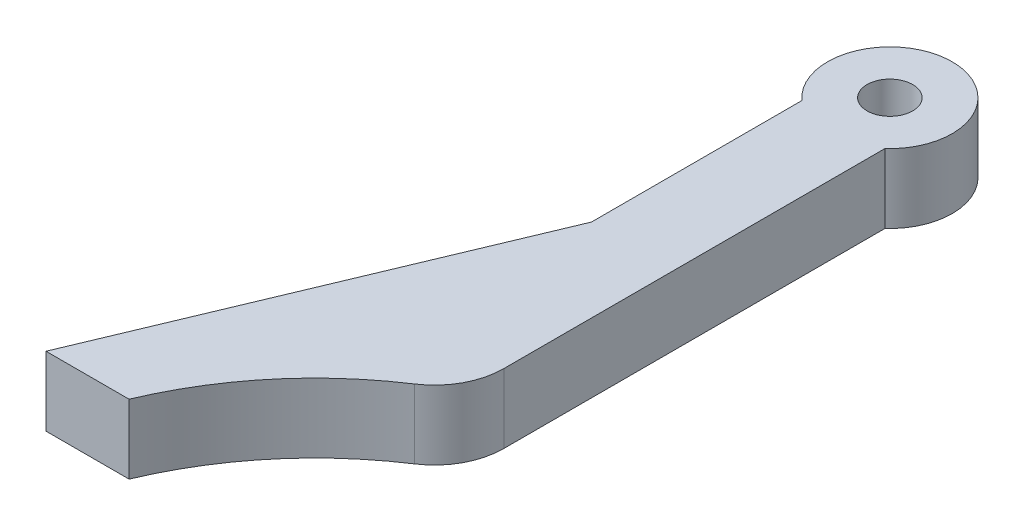
ISO-10303-21;
HEADER;
FILE_DESCRIPTION(('STEP AP214'),'2;1');
FILE_NAME('part.step','',(''),(''),'','','');
FILE_SCHEMA(('AUTOMOTIVE_DESIGN { 1 0 10303 214 1 1 1 1 }'));
ENDSEC;
DATA;
#1=APPLICATION_CONTEXT('core data for automotive mechanical design processes');
#2=APPLICATION_PROTOCOL_DEFINITION('international standard','automotive_design',2000,#1);
#3=PRODUCT_CONTEXT('',#1,'mechanical');
#4=PRODUCT('Part','Part','',(#3));
#5=PRODUCT_RELATED_PRODUCT_CATEGORY('part','',(#4));
#6=PRODUCT_DEFINITION_FORMATION('','',#4);
#7=PRODUCT_DEFINITION_CONTEXT('part definition',#1,'design');
#8=PRODUCT_DEFINITION('design','',#6,#7);
#9=PRODUCT_DEFINITION_SHAPE('','',#8);
#10=(LENGTH_UNIT() NAMED_UNIT(*) SI_UNIT(.MILLI.,.METRE.));
#11=(NAMED_UNIT(*) PLANE_ANGLE_UNIT() SI_UNIT($,.RADIAN.));
#12=(NAMED_UNIT(*) SI_UNIT($,.STERADIAN.) SOLID_ANGLE_UNIT());
#13=UNCERTAINTY_MEASURE_WITH_UNIT(LENGTH_MEASURE(1.E-05),#10,'distance_accuracy_value','');
#14=(GEOMETRIC_REPRESENTATION_CONTEXT(3) GLOBAL_UNCERTAINTY_ASSIGNED_CONTEXT((#13)) GLOBAL_UNIT_ASSIGNED_CONTEXT((#10,
#11,#12)) REPRESENTATION_CONTEXT('',''));
#15=CARTESIAN_POINT('',(0.,0.,0.));
#16=DIRECTION('',(0.,0.,1.));
#17=DIRECTION('',(1.,0.,0.));
#18=AXIS2_PLACEMENT_3D('',#15,#16,#17);
#19=CARTESIAN_POINT('',(3.,5.,3.35410196624968));
#20=DIRECTION('',(-1.,0.,0.));
#21=DIRECTION('',(0.,0.,1.));
#22=AXIS2_PLACEMENT_3D('',#19,#20,#21);
#23=PLANE('',#22);
#24=DIRECTION('',(0.,0.,-1.));
#25=VECTOR('',#24,1.);
#26=CARTESIAN_POINT('',(3.00000000000001,5.,43.8541019662497));
#27=LINE('',#26,#25);
#28=CARTESIAN_POINT('',(3.,5.,30.8819886854511));
#29=VERTEX_POINT('',#28);
#30=CARTESIAN_POINT('',(3.,5.,3.35410196624968));
#31=VERTEX_POINT('',#30);
#32=EDGE_CURVE('E145',#29,#31,#27,.T.);
#33=ORIENTED_EDGE('',*,*,#32,.F.);
#34=DIRECTION('',(0.,-1.,0.));
#35=VECTOR('',#34,1.);
#36=CARTESIAN_POINT('',(3.00000000000001,0.,30.8819886854511));
#37=LINE('',#36,#35);
#38=CARTESIAN_POINT('',(3.00000000000001,0.,30.8819886854511));
#39=VERTEX_POINT('',#38);
#40=EDGE_CURVE('E51',#29,#39,#37,.T.);
#41=ORIENTED_EDGE('',*,*,#40,.T.);
#42=DIRECTION('',(0.,0.,-1.));
#43=VECTOR('',#42,1.);
#44=CARTESIAN_POINT('',(3.,0.,3.35410196624968));
#45=LINE('',#44,#43);
#46=CARTESIAN_POINT('',(3.,0.,3.35410196624968));
#47=VERTEX_POINT('',#46);
#48=EDGE_CURVE('E133',#39,#47,#45,.T.);
#49=ORIENTED_EDGE('',*,*,#48,.T.);
#50=DIRECTION('',(0.,-1.,0.));
#51=VECTOR('',#50,1.);
#52=CARTESIAN_POINT('',(3.,5.,3.35410196624968));
#53=LINE('',#52,#51);
#54=EDGE_CURVE('E165',#31,#47,#53,.T.);
#55=ORIENTED_EDGE('',*,*,#54,.F.);
#56=EDGE_LOOP('',(#33,#41,#49,#55));
#57=FACE_BOUND('',#56,.T.);
#58=ADVANCED_FACE('F42',(#57),#23,.F.);
#59=CARTESIAN_POINT('',(0.,5.,0.));
#60=DIRECTION('',(0.,-1.,0.));
#61=DIRECTION('',(0.,0.,-1.));
#62=AXIS2_PLACEMENT_3D('',#59,#60,#61);
#63=CYLINDRICAL_SURFACE('',#62,4.5);
#64=CARTESIAN_POINT('',(0.,0.,0.));
#65=DIRECTION('',(0.,1.,0.));
#66=DIRECTION('',(0.,0.,1.));
#67=AXIS2_PLACEMENT_3D('',#64,#65,#66);
#68=CIRCLE('',#67,4.5);
#69=CARTESIAN_POINT('',(-3.,0.,3.35410196624968));
#70=VERTEX_POINT('',#69);
#71=EDGE_CURVE('E156',#47,#70,#68,.T.);
#72=ORIENTED_EDGE('',*,*,#71,.T.);
#73=DIRECTION('',(0.,-1.,0.));
#74=VECTOR('',#73,1.);
#75=CARTESIAN_POINT('',(-3.,5.,3.35410196624968));
#76=LINE('',#75,#74);
#77=CARTESIAN_POINT('',(-3.,5.,3.35410196624968));
#78=VERTEX_POINT('',#77);
#79=EDGE_CURVE('E153',#78,#70,#76,.T.);
#80=ORIENTED_EDGE('',*,*,#79,.F.);
#81=CARTESIAN_POINT('',(0.,5.,0.));
#82=DIRECTION('',(0.,1.,0.));
#83=DIRECTION('',(0.,0.,1.));
#84=AXIS2_PLACEMENT_3D('',#81,#82,#83);
#85=CIRCLE('',#84,4.5);
#86=EDGE_CURVE('E149',#31,#78,#85,.T.);
#87=ORIENTED_EDGE('',*,*,#86,.F.);
#88=ORIENTED_EDGE('',*,*,#54,.T.);
#89=EDGE_LOOP('',(#72,#80,#87,#88));
#90=FACE_BOUND('',#89,.T.);
#91=ADVANCED_FACE('F194',(#90),#63,.T.);
#92=CARTESIAN_POINT('',(-3.,5.,3.35410196624968));
#93=DIRECTION('',(1.,0.,0.));
#94=DIRECTION('',(0.,0.,-1.));
#95=AXIS2_PLACEMENT_3D('',#92,#93,#94);
#96=PLANE('',#95);
#97=DIRECTION('',(0.,0.,1.));
#98=VECTOR('',#97,1.);
#99=CARTESIAN_POINT('',(-3.,0.,3.35410196624968));
#100=LINE('',#99,#98);
#101=CARTESIAN_POINT('',(-3.,0.,18.5500745429482));
#102=VERTEX_POINT('',#101);
#103=EDGE_CURVE('E146',#70,#102,#100,.T.);
#104=ORIENTED_EDGE('',*,*,#103,.T.);
#105=DIRECTION('',(0.,1.,0.));
#106=VECTOR('',#105,1.);
#107=CARTESIAN_POINT('',(-3.,0.,18.5500745429482));
#108=LINE('',#107,#106);
#109=CARTESIAN_POINT('',(-3.,5.,18.5500745429482));
#110=VERTEX_POINT('',#109);
#111=EDGE_CURVE('E233',#102,#110,#108,.T.);
#112=ORIENTED_EDGE('',*,*,#111,.T.);
#113=DIRECTION('',(0.,0.,1.));
#114=VECTOR('',#113,1.);
#115=CARTESIAN_POINT('',(-3.,5.,7.41619848709566));
#116=LINE('',#115,#114);
#117=EDGE_CURVE('E141',#78,#110,#116,.T.);
#118=ORIENTED_EDGE('',*,*,#117,.F.);
#119=ORIENTED_EDGE('',*,*,#79,.T.);
#120=EDGE_LOOP('',(#104,#112,#118,#119));
#121=FACE_BOUND('',#120,.T.);
#122=ADVANCED_FACE('F198',(#121),#96,.F.);
#123=CARTESIAN_POINT('',(0.,5.,0.));
#124=DIRECTION('',(0.,1.,0.));
#125=DIRECTION('',(0.,0.,1.));
#126=AXIS2_PLACEMENT_3D('',#123,#124,#125);
#127=PLANE('',#126);
#128=DIRECTION('',(-1.,0.,0.));
#129=VECTOR('',#128,1.);
#130=CARTESIAN_POINT('',(-14.6149676840736,5.,46.3249242689621));
#131=LINE('',#130,#129);
#132=CARTESIAN_POINT('',(-8.61496768407357,5.,46.3249242689621));
#133=VERTEX_POINT('',#132);
#134=CARTESIAN_POINT('',(-14.6149676840736,5.,46.3249242689621));
#135=VERTEX_POINT('',#134);
#136=EDGE_CURVE('E112',#133,#135,#131,.T.);
#137=ORIENTED_EDGE('',*,*,#136,.F.);
#138=CARTESIAN_POINT('',(14.4495202218953,5.,55.9700991059163));
#139=DIRECTION('',(0.,-1.,0.));
#140=DIRECTION('',(0.,0.,1.));
#141=AXIS2_PLACEMENT_3D('',#138,#139,#140);
#142=CIRCLE('',#141,25.);
#143=CARTESIAN_POINT('',(0.741586703649219,5.,35.0633404221953));
#144=VERTEX_POINT('',#143);
#145=EDGE_CURVE('E119',#133,#144,#142,.T.);
#146=ORIENTED_EDGE('',*,*,#145,.T.);
#147=CARTESIAN_POINT('',(-1.99999999999999,5.,30.8819886854511));
#148=DIRECTION('',(0.,1.,0.));
#149=DIRECTION('',(0.,0.,1.));
#150=AXIS2_PLACEMENT_3D('',#147,#148,#149);
#151=CIRCLE('',#150,5.);
#152=EDGE_CURVE('E65',#144,#29,#151,.T.);
#153=ORIENTED_EDGE('',*,*,#152,.T.);
#154=ORIENTED_EDGE('',*,*,#32,.T.);
#155=ORIENTED_EDGE('',*,*,#86,.T.);
#156=ORIENTED_EDGE('',*,*,#117,.T.);
#157=DIRECTION('',(-0.38580699347817,0.,0.922579516238755));
#158=VECTOR('',#157,1.);
#159=CARTESIAN_POINT('',(-3.,5.,18.5500745429482));
#160=LINE('',#159,#158);
#161=EDGE_CURVE('E121',#110,#135,#160,.T.);
#162=ORIENTED_EDGE('',*,*,#161,.T.);
#163=EDGE_LOOP('',(#137,#146,#153,#154,#155,#156,#162));
#164=FACE_BOUND('',#163,.T.);
#165=CARTESIAN_POINT('',(0.,5.,0.));
#166=DIRECTION('',(0.,1.,0.));
#167=DIRECTION('',(0.,0.,1.));
#168=AXIS2_PLACEMENT_3D('',#165,#166,#167);
#169=CIRCLE('',#168,1.65);
#170=CARTESIAN_POINT('',(0.,5.,1.65));
#171=VERTEX_POINT('',#170);
#172=EDGE_CURVE('E128',#171,#171,#169,.T.);
#173=ORIENTED_EDGE('',*,*,#172,.F.);
#174=EDGE_LOOP('',(#173));
#175=FACE_BOUND('',#174,.T.);
#176=ADVANCED_FACE('F204',(#164,#175),#127,.T.);
#177=CARTESIAN_POINT('',(0.,0.,0.));
#178=DIRECTION('',(0.,1.,0.));
#179=DIRECTION('',(0.,0.,1.));
#180=AXIS2_PLACEMENT_3D('',#177,#178,#179);
#181=PLANE('',#180);
#182=CARTESIAN_POINT('',(14.4495202218953,0.,55.9700991059163));
#183=DIRECTION('',(0.,-1.,0.));
#184=DIRECTION('',(0.,0.,1.));
#185=AXIS2_PLACEMENT_3D('',#182,#183,#184);
#186=CIRCLE('',#185,25.);
#187=CARTESIAN_POINT('',(-8.61496768407357,0.,46.3249242689621));
#188=VERTEX_POINT('',#187);
#189=CARTESIAN_POINT('',(0.741586703649219,0.,35.0633404221953));
#190=VERTEX_POINT('',#189);
#191=EDGE_CURVE('E118',#188,#190,#186,.T.);
#192=ORIENTED_EDGE('',*,*,#191,.F.);
#193=DIRECTION('',(-1.,0.,0.));
#194=VECTOR('',#193,1.);
#195=CARTESIAN_POINT('',(-14.6149676840736,0.,46.3249242689621));
#196=LINE('',#195,#194);
#197=CARTESIAN_POINT('',(-14.6149676840736,0.,46.3249242689621));
#198=VERTEX_POINT('',#197);
#199=EDGE_CURVE('E100',#188,#198,#196,.T.);
#200=ORIENTED_EDGE('',*,*,#199,.T.);
#201=DIRECTION('',(-0.38580699347817,0.,0.922579516238755));
#202=VECTOR('',#201,1.);
#203=CARTESIAN_POINT('',(-3.,0.,18.5500745429482));
#204=LINE('',#203,#202);
#205=EDGE_CURVE('E237',#102,#198,#204,.T.);
#206=ORIENTED_EDGE('',*,*,#205,.F.);
#207=ORIENTED_EDGE('',*,*,#103,.F.);
#208=ORIENTED_EDGE('',*,*,#71,.F.);
#209=ORIENTED_EDGE('',*,*,#48,.F.);
#210=CARTESIAN_POINT('',(-1.99999999999999,0.,30.8819886854511));
#211=DIRECTION('',(0.,1.,0.));
#212=DIRECTION('',(0.,0.,1.));
#213=AXIS2_PLACEMENT_3D('',#210,#211,#212);
#214=CIRCLE('',#213,5.);
#215=EDGE_CURVE('E11',#39,#190,#214,.F.);
#216=ORIENTED_EDGE('',*,*,#215,.T.);
#217=EDGE_LOOP('',(#192,#200,#206,#207,#208,#209,#216));
#218=FACE_BOUND('',#217,.T.);
#219=CARTESIAN_POINT('',(0.,0.,0.));
#220=DIRECTION('',(0.,1.,0.));
#221=DIRECTION('',(0.,0.,1.));
#222=AXIS2_PLACEMENT_3D('',#219,#220,#221);
#223=CIRCLE('',#222,3.);
#224=CARTESIAN_POINT('',(0.,0.,3.));
#225=VERTEX_POINT('',#224);
#226=EDGE_CURVE('E135',#225,#225,#223,.T.);
#227=ORIENTED_EDGE('',*,*,#226,.T.);
#228=EDGE_LOOP('',(#227));
#229=FACE_BOUND('',#228,.T.);
#230=ADVANCED_FACE('F123',(#218,#229),#181,.F.);
#231=CARTESIAN_POINT('',(0.,-4.66690475583121,0.));
#232=DIRECTION('',(0.,1.,0.));
#233=DIRECTION('',(0.,0.,1.));
#234=AXIS2_PLACEMENT_3D('',#231,#232,#233);
#235=CYLINDRICAL_SURFACE('',#234,1.65);
#236=CARTESIAN_POINT('',(0.,0.5,0.));
#237=DIRECTION('',(0.,1.,0.));
#238=DIRECTION('',(0.,0.,1.));
#239=AXIS2_PLACEMENT_3D('',#236,#237,#238);
#240=CIRCLE('',#239,1.65);
#241=CARTESIAN_POINT('',(0.,0.5,1.65));
#242=VERTEX_POINT('',#241);
#243=EDGE_CURVE('E170',#242,#242,#240,.F.);
#244=ORIENTED_EDGE('',*,*,#243,.T.);
#245=EDGE_LOOP('',(#244));
#246=FACE_BOUND('',#245,.T.);
#247=ORIENTED_EDGE('',*,*,#172,.T.);
#248=EDGE_LOOP('',(#247));
#249=FACE_BOUND('',#248,.T.);
#250=ADVANCED_FACE('F208',(#246,#249),#235,.F.);
#251=CARTESIAN_POINT('',(14.4495202218953,0.,55.9700991059163));
#252=DIRECTION('',(0.,1.,0.));
#253=DIRECTION('',(0.,0.,1.));
#254=AXIS2_PLACEMENT_3D('',#251,#252,#253);
#255=CYLINDRICAL_SURFACE('',#254,25.);
#256=DIRECTION('',(0.,1.,0.));
#257=VECTOR('',#256,1.);
#258=CARTESIAN_POINT('',(-8.61496768407357,0.,46.3249242689621));
#259=LINE('',#258,#257);
#260=EDGE_CURVE('E103',#188,#133,#259,.T.);
#261=ORIENTED_EDGE('',*,*,#260,.F.);
#262=ORIENTED_EDGE('',*,*,#191,.T.);
#263=DIRECTION('',(0.,1.,0.));
#264=VECTOR('',#263,1.);
#265=CARTESIAN_POINT('',(0.741586703649219,0.,35.0633404221953));
#266=LINE('',#265,#264);
#267=EDGE_CURVE('E169',#190,#144,#266,.T.);
#268=ORIENTED_EDGE('',*,*,#267,.T.);
#269=ORIENTED_EDGE('',*,*,#145,.F.);
#270=EDGE_LOOP('',(#261,#262,#268,#269));
#271=FACE_BOUND('',#270,.T.);
#272=ADVANCED_FACE('F116',(#271),#255,.F.);
#273=CARTESIAN_POINT('',(0.,-2.5,0.));
#274=DIRECTION('',(0.,1.,0.));
#275=DIRECTION('',(0.,0.,1.));
#276=AXIS2_PLACEMENT_3D('',#273,#274,#275);
#277=CYLINDRICAL_SURFACE('',#276,3.);
#278=CARTESIAN_POINT('',(0.,0.5,0.));
#279=DIRECTION('',(0.,1.,0.));
#280=DIRECTION('',(0.,0.,1.));
#281=AXIS2_PLACEMENT_3D('',#278,#279,#280);
#282=CIRCLE('',#281,3.);
#283=CARTESIAN_POINT('',(0.,0.5,3.));
#284=VERTEX_POINT('',#283);
#285=EDGE_CURVE('E138',#284,#284,#282,.T.);
#286=ORIENTED_EDGE('',*,*,#285,.T.);
#287=EDGE_LOOP('',(#286));
#288=FACE_BOUND('',#287,.T.);
#289=ORIENTED_EDGE('',*,*,#226,.F.);
#290=EDGE_LOOP('',(#289));
#291=FACE_BOUND('',#290,.T.);
#292=ADVANCED_FACE('F216',(#288,#291),#277,.F.);
#293=CARTESIAN_POINT('',(0.,0.5,0.));
#294=DIRECTION('',(0.,1.,0.));
#295=DIRECTION('',(0.,0.,1.));
#296=AXIS2_PLACEMENT_3D('',#293,#294,#295);
#297=PLANE('',#296);
#298=ORIENTED_EDGE('',*,*,#285,.F.);
#299=EDGE_LOOP('',(#298));
#300=FACE_BOUND('',#299,.T.);
#301=ORIENTED_EDGE('',*,*,#243,.F.);
#302=EDGE_LOOP('',(#301));
#303=FACE_BOUND('',#302,.T.);
#304=ADVANCED_FACE('F190',(#300,#303),#297,.F.);
#305=CARTESIAN_POINT('',(-3.,0.,18.5500745429482));
#306=DIRECTION('',(-0.922579516238755,0.,-0.38580699347817));
#307=DIRECTION('',(-0.38580699347817,0.,0.922579516238755));
#308=AXIS2_PLACEMENT_3D('',#305,#306,#307);
#309=PLANE('',#308);
#310=ORIENTED_EDGE('',*,*,#161,.F.);
#311=ORIENTED_EDGE('',*,*,#111,.F.);
#312=ORIENTED_EDGE('',*,*,#205,.T.);
#313=DIRECTION('',(0.,1.,0.));
#314=VECTOR('',#313,1.);
#315=CARTESIAN_POINT('',(-14.6149676840736,0.,46.3249242689621));
#316=LINE('',#315,#314);
#317=EDGE_CURVE('E106',#198,#135,#316,.T.);
#318=ORIENTED_EDGE('',*,*,#317,.T.);
#319=EDGE_LOOP('',(#310,#311,#312,#318));
#320=FACE_BOUND('',#319,.T.);
#321=ADVANCED_FACE('F183',(#320),#309,.T.);
#322=CARTESIAN_POINT('',(-1.99999999999999,0.,30.8819886854511));
#323=DIRECTION('',(0.,1.,0.));
#324=DIRECTION('',(0.,0.,1.));
#325=AXIS2_PLACEMENT_3D('',#322,#323,#324);
#326=CYLINDRICAL_SURFACE('',#325,5.);
#327=ORIENTED_EDGE('',*,*,#215,.F.);
#328=ORIENTED_EDGE('',*,*,#40,.F.);
#329=ORIENTED_EDGE('',*,*,#152,.F.);
#330=ORIENTED_EDGE('',*,*,#267,.F.);
#331=EDGE_LOOP('',(#327,#328,#329,#330));
#332=FACE_BOUND('',#331,.T.);
#333=ADVANCED_FACE('F44',(#332),#326,.T.);
#334=CARTESIAN_POINT('',(-14.6149676840736,0.,46.3249242689621));
#335=DIRECTION('',(0.,0.,-1.));
#336=DIRECTION('',(-1.,0.,0.));
#337=AXIS2_PLACEMENT_3D('',#334,#335,#336);
#338=PLANE('',#337);
#339=ORIENTED_EDGE('',*,*,#136,.T.);
#340=ORIENTED_EDGE('',*,*,#317,.F.);
#341=ORIENTED_EDGE('',*,*,#199,.F.);
#342=ORIENTED_EDGE('',*,*,#260,.T.);
#343=EDGE_LOOP('',(#339,#340,#341,#342));
#344=FACE_BOUND('',#343,.T.);
#345=ADVANCED_FACE('F102',(#344),#338,.F.);
#346=CLOSED_SHELL('',(#58,#91,#122,#176,#230,#250,#272,#292,#304,#321,#333,#345));
#347=MANIFOLD_SOLID_BREP('B2',#346);
#348=ADVANCED_BREP_SHAPE_REPRESENTATION('',(#18,#347),#14);
#349=SHAPE_DEFINITION_REPRESENTATION(#9,#348);
ENDSEC;
END-ISO-10303-21;
